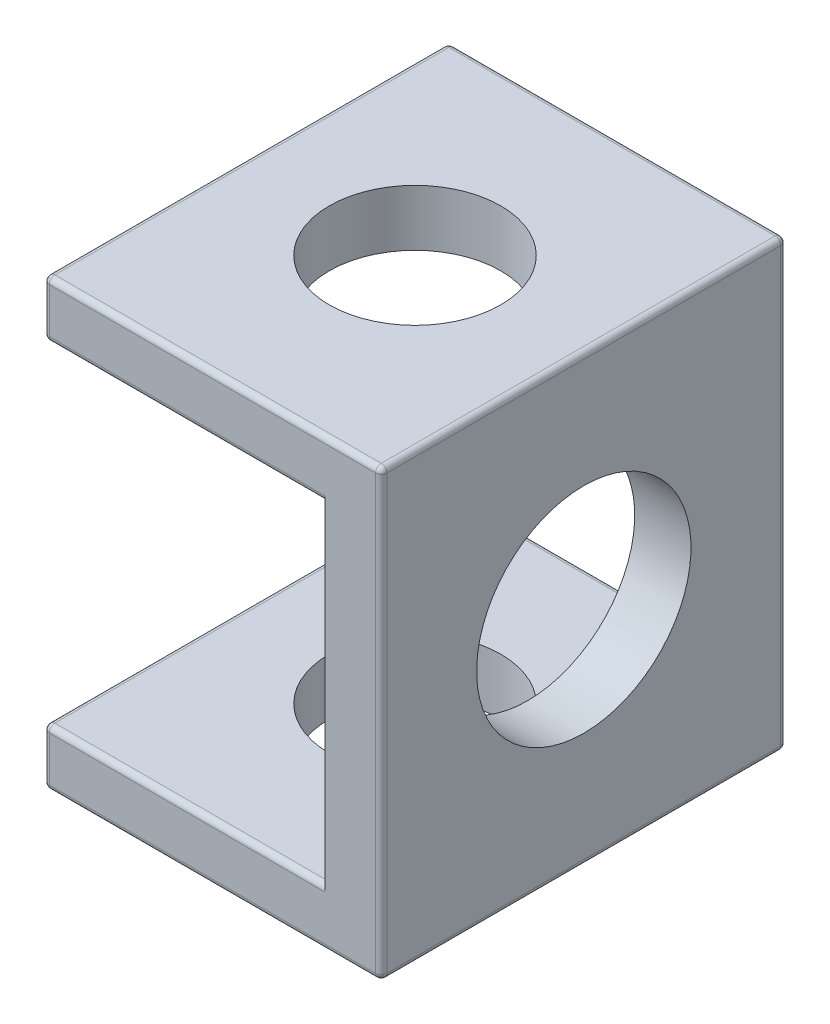
ISO-10303-21;
HEADER;
FILE_DESCRIPTION(('STEP AP214'),'2;1');
FILE_NAME('part.step','',(''),(''),'','','');
FILE_SCHEMA(('AUTOMOTIVE_DESIGN { 1 0 10303 214 1 1 1 1 }'));
ENDSEC;
DATA;
#1=APPLICATION_CONTEXT('core data for automotive mechanical design processes');
#2=APPLICATION_PROTOCOL_DEFINITION('international standard','automotive_design',2000,#1);
#3=PRODUCT_CONTEXT('',#1,'mechanical');
#4=PRODUCT('Part','Part','',(#3));
#5=PRODUCT_RELATED_PRODUCT_CATEGORY('part','',(#4));
#6=PRODUCT_DEFINITION_FORMATION('','',#4);
#7=PRODUCT_DEFINITION_CONTEXT('part definition',#1,'design');
#8=PRODUCT_DEFINITION('design','',#6,#7);
#9=PRODUCT_DEFINITION_SHAPE('','',#8);
#10=(LENGTH_UNIT() NAMED_UNIT(*) SI_UNIT(.MILLI.,.METRE.));
#11=(NAMED_UNIT(*) PLANE_ANGLE_UNIT() SI_UNIT($,.RADIAN.));
#12=(NAMED_UNIT(*) SI_UNIT($,.STERADIAN.) SOLID_ANGLE_UNIT());
#13=UNCERTAINTY_MEASURE_WITH_UNIT(LENGTH_MEASURE(1.E-05),#10,'distance_accuracy_value','');
#14=(GEOMETRIC_REPRESENTATION_CONTEXT(3) GLOBAL_UNCERTAINTY_ASSIGNED_CONTEXT((#13)) GLOBAL_UNIT_ASSIGNED_CONTEXT((#10,
#11,#12)) REPRESENTATION_CONTEXT('',''));
#15=CARTESIAN_POINT('',(0.,0.,0.));
#16=DIRECTION('',(0.,0.,1.));
#17=DIRECTION('',(1.,0.,0.));
#18=AXIS2_PLACEMENT_3D('',#15,#16,#17);
#19=CARTESIAN_POINT('',(60.,-69.,72.));
#20=DIRECTION('',(0.,-1.,0.));
#21=DIRECTION('',(1.,0.,0.));
#22=AXIS2_PLACEMENT_3D('',#19,#20,#21);
#23=PLANE('',#22);
#24=CARTESIAN_POINT('',(30.,-69.,36.));
#25=DIRECTION('',(0.,-1.,0.));
#26=DIRECTION('',(1.,0.,0.));
#27=AXIS2_PLACEMENT_3D('',#24,#25,#26);
#28=CIRCLE('',#27,15.24);
#29=CARTESIAN_POINT('',(45.24,-69.,36.));
#30=VERTEX_POINT('',#29);
#31=EDGE_CURVE('E1032',#30,#30,#28,.T.);
#32=ORIENTED_EDGE('',*,*,#31,.T.);
#33=EDGE_LOOP('',(#32));
#34=FACE_BOUND('',#33,.T.);
#35=DIRECTION('',(0.,0.,-1.));
#36=VECTOR('',#35,1.);
#37=CARTESIAN_POINT('',(50.,-69.,72.));
#38=LINE('',#37,#36);
#39=CARTESIAN_POINT('',(50.,-69.,71.));
#40=VERTEX_POINT('',#39);
#41=CARTESIAN_POINT('',(50.,-69.,1.));
#42=VERTEX_POINT('',#41);
#43=EDGE_CURVE('E475',#40,#42,#38,.T.);
#44=ORIENTED_EDGE('',*,*,#43,.T.);
#45=DIRECTION('',(-1.,0.,0.));
#46=VECTOR('',#45,1.);
#47=CARTESIAN_POINT('',(1.,-69.,1.));
#48=LINE('',#47,#46);
#49=CARTESIAN_POINT('',(1.,-69.,1.));
#50=VERTEX_POINT('',#49);
#51=EDGE_CURVE('E358',#42,#50,#48,.T.);
#52=ORIENTED_EDGE('',*,*,#51,.T.);
#53=DIRECTION('',(0.,0.,-1.));
#54=VECTOR('',#53,1.);
#55=CARTESIAN_POINT('',(1.,-69.,72.));
#56=LINE('',#55,#54);
#57=CARTESIAN_POINT('',(1.,-69.,71.));
#58=VERTEX_POINT('',#57);
#59=EDGE_CURVE('E343',#50,#58,#56,.F.);
#60=ORIENTED_EDGE('',*,*,#59,.T.);
#61=DIRECTION('',(-1.,0.,0.));
#62=VECTOR('',#61,1.);
#63=CARTESIAN_POINT('',(60.,-69.,71.));
#64=LINE('',#63,#62);
#65=EDGE_CURVE('E355',#58,#40,#64,.F.);
#66=ORIENTED_EDGE('',*,*,#65,.T.);
#67=EDGE_LOOP('',(#44,#52,#60,#66));
#68=FACE_BOUND('',#67,.T.);
#69=ADVANCED_FACE('F41',(#34,#68),#23,.F.);
#70=CARTESIAN_POINT('',(0.,-79.,72.));
#71=DIRECTION('',(-1.,0.,0.));
#72=DIRECTION('',(0.,-1.,0.));
#73=AXIS2_PLACEMENT_3D('',#70,#71,#72);
#74=PLANE('',#73);
#75=DIRECTION('',(0.,0.,-1.));
#76=VECTOR('',#75,1.);
#77=CARTESIAN_POINT('',(0.,-70.,0.));
#78=LINE('',#77,#76);
#79=CARTESIAN_POINT('',(0.,-70.,71.));
#80=VERTEX_POINT('',#79);
#81=CARTESIAN_POINT('',(0.,-70.,1.));
#82=VERTEX_POINT('',#81);
#83=EDGE_CURVE('E324',#80,#82,#78,.T.);
#84=ORIENTED_EDGE('',*,*,#83,.T.);
#85=DIRECTION('',(0.,1.,0.));
#86=VECTOR('',#85,1.);
#87=CARTESIAN_POINT('',(0.,-79.,1.));
#88=LINE('',#87,#86);
#89=CARTESIAN_POINT('',(0.,-78.,1.));
#90=VERTEX_POINT('',#89);
#91=EDGE_CURVE('E381',#82,#90,#88,.F.);
#92=ORIENTED_EDGE('',*,*,#91,.T.);
#93=DIRECTION('',(0.,0.,-1.));
#94=VECTOR('',#93,1.);
#95=CARTESIAN_POINT('',(0.,-78.,72.));
#96=LINE('',#95,#94);
#97=CARTESIAN_POINT('',(0.,-78.,71.));
#98=VERTEX_POINT('',#97);
#99=EDGE_CURVE('E351',#90,#98,#96,.F.);
#100=ORIENTED_EDGE('',*,*,#99,.T.);
#101=DIRECTION('',(0.,1.,0.));
#102=VECTOR('',#101,1.);
#103=CARTESIAN_POINT('',(0.,-70.,71.));
#104=LINE('',#103,#102);
#105=EDGE_CURVE('E378',#98,#80,#104,.T.);
#106=ORIENTED_EDGE('',*,*,#105,.T.);
#107=EDGE_LOOP('',(#84,#92,#100,#106));
#108=FACE_BOUND('',#107,.T.);
#109=ADVANCED_FACE('F566',(#108),#74,.T.);
#110=CARTESIAN_POINT('',(60.,-79.,72.));
#111=DIRECTION('',(0.,-1.,0.));
#112=DIRECTION('',(1.,0.,0.));
#113=AXIS2_PLACEMENT_3D('',#110,#111,#112);
#114=PLANE('',#113);
#115=CARTESIAN_POINT('',(30.,-79.,36.));
#116=DIRECTION('',(0.,-1.,0.));
#117=DIRECTION('',(1.,0.,0.));
#118=AXIS2_PLACEMENT_3D('',#115,#116,#117);
#119=CIRCLE('',#118,15.24);
#120=CARTESIAN_POINT('',(45.24,-79.,36.));
#121=VERTEX_POINT('',#120);
#122=EDGE_CURVE('E994',#121,#121,#119,.T.);
#123=ORIENTED_EDGE('',*,*,#122,.F.);
#124=EDGE_LOOP('',(#123));
#125=FACE_BOUND('',#124,.T.);
#126=DIRECTION('',(0.,0.,-1.));
#127=VECTOR('',#126,1.);
#128=CARTESIAN_POINT('',(1.00000000000001,-79.,72.));
#129=LINE('',#128,#127);
#130=CARTESIAN_POINT('',(1.00000000000001,-79.,71.));
#131=VERTEX_POINT('',#130);
#132=CARTESIAN_POINT('',(1.00000000000001,-79.,1.));
#133=VERTEX_POINT('',#132);
#134=EDGE_CURVE('E347',#131,#133,#129,.T.);
#135=ORIENTED_EDGE('',*,*,#134,.T.);
#136=DIRECTION('',(-1.,0.,0.));
#137=VECTOR('',#136,1.);
#138=CARTESIAN_POINT('',(60.,-79.,1.));
#139=LINE('',#138,#137);
#140=CARTESIAN_POINT('',(59.,-79.,1.));
#141=VERTEX_POINT('',#140);
#142=EDGE_CURVE('E396',#133,#141,#139,.F.);
#143=ORIENTED_EDGE('',*,*,#142,.T.);
#144=DIRECTION('',(0.,0.,-1.));
#145=VECTOR('',#144,1.);
#146=CARTESIAN_POINT('',(59.,-79.,72.));
#147=LINE('',#146,#145);
#148=CARTESIAN_POINT('',(59.,-79.,71.));
#149=VERTEX_POINT('',#148);
#150=EDGE_CURVE('E393',#141,#149,#147,.F.);
#151=ORIENTED_EDGE('',*,*,#150,.T.);
#152=DIRECTION('',(-1.,0.,0.));
#153=VECTOR('',#152,1.);
#154=CARTESIAN_POINT('',(1.00000000000002,-79.,71.));
#155=LINE('',#154,#153);
#156=EDGE_CURVE('E390',#149,#131,#155,.T.);
#157=ORIENTED_EDGE('',*,*,#156,.T.);
#158=EDGE_LOOP('',(#135,#143,#151,#157));
#159=FACE_BOUND('',#158,.T.);
#160=ADVANCED_FACE('F572',(#125,#159),#114,.T.);
#161=CARTESIAN_POINT('',(60.,0.,72.));
#162=DIRECTION('',(1.,0.,0.));
#163=DIRECTION('',(0.,1.,0.));
#164=AXIS2_PLACEMENT_3D('',#161,#162,#163);
#165=PLANE('',#164);
#166=CARTESIAN_POINT('',(60.,-39.5,36.));
#167=DIRECTION('',(-1.,0.,0.));
#168=DIRECTION('',(0.,-1.,0.));
#169=AXIS2_PLACEMENT_3D('',#166,#167,#168);
#170=CIRCLE('',#169,19.05);
#171=CARTESIAN_POINT('',(60.,-58.55,36.));
#172=VERTEX_POINT('',#171);
#173=EDGE_CURVE('E1033',#172,#172,#170,.T.);
#174=ORIENTED_EDGE('',*,*,#173,.T.);
#175=EDGE_LOOP('',(#174));
#176=FACE_BOUND('',#175,.T.);
#177=DIRECTION('',(0.,-1.,0.));
#178=VECTOR('',#177,1.);
#179=CARTESIAN_POINT('',(60.,-79.,71.));
#180=LINE('',#179,#178);
#181=CARTESIAN_POINT('',(60.,-1.,71.));
#182=VERTEX_POINT('',#181);
#183=CARTESIAN_POINT('',(60.,-78.,71.));
#184=VERTEX_POINT('',#183);
#185=EDGE_CURVE('E305',#182,#184,#180,.T.);
#186=ORIENTED_EDGE('',*,*,#185,.T.);
#187=DIRECTION('',(0.,0.,-1.));
#188=VECTOR('',#187,1.);
#189=CARTESIAN_POINT('',(60.,-78.,72.));
#190=LINE('',#189,#188);
#191=CARTESIAN_POINT('',(60.,-78.,1.));
#192=VERTEX_POINT('',#191);
#193=EDGE_CURVE('E402',#184,#192,#190,.T.);
#194=ORIENTED_EDGE('',*,*,#193,.T.);
#195=DIRECTION('',(0.,-1.,0.));
#196=VECTOR('',#195,1.);
#197=CARTESIAN_POINT('',(60.,0.,1.));
#198=LINE('',#197,#196);
#199=CARTESIAN_POINT('',(60.,-1.,1.));
#200=VERTEX_POINT('',#199);
#201=EDGE_CURVE('E302',#192,#200,#198,.F.);
#202=ORIENTED_EDGE('',*,*,#201,.T.);
#203=DIRECTION('',(0.,0.,-1.));
#204=VECTOR('',#203,1.);
#205=CARTESIAN_POINT('',(60.,-1.,72.));
#206=LINE('',#205,#204);
#207=EDGE_CURVE('E283',#200,#182,#206,.F.);
#208=ORIENTED_EDGE('',*,*,#207,.T.);
#209=EDGE_LOOP('',(#186,#194,#202,#208));
#210=FACE_BOUND('',#209,.T.);
#211=ADVANCED_FACE('F945',(#176,#210),#165,.T.);
#212=CARTESIAN_POINT('',(0.,0.,72.));
#213=DIRECTION('',(0.,1.,0.));
#214=DIRECTION('',(0.,0.,1.));
#215=AXIS2_PLACEMENT_3D('',#212,#213,#214);
#216=PLANE('',#215);
#217=CARTESIAN_POINT('',(30.,0.,36.));
#218=DIRECTION('',(0.,1.,0.));
#219=DIRECTION('',(0.,0.,1.));
#220=AXIS2_PLACEMENT_3D('',#217,#218,#219);
#221=CIRCLE('',#220,15.24);
#222=CARTESIAN_POINT('',(30.,0.,51.24));
#223=VERTEX_POINT('',#222);
#224=EDGE_CURVE('E1037',#223,#223,#221,.T.);
#225=ORIENTED_EDGE('',*,*,#224,.F.);
#226=EDGE_LOOP('',(#225));
#227=FACE_BOUND('',#226,.T.);
#228=DIRECTION('',(1.,0.,0.));
#229=VECTOR('',#228,1.);
#230=CARTESIAN_POINT('',(60.,0.,71.));
#231=LINE('',#230,#229);
#232=CARTESIAN_POINT('',(1.,0.,71.));
#233=VERTEX_POINT('',#232);
#234=CARTESIAN_POINT('',(59.,0.,71.));
#235=VERTEX_POINT('',#234);
#236=EDGE_CURVE('E272',#233,#235,#231,.T.);
#237=ORIENTED_EDGE('',*,*,#236,.T.);
#238=DIRECTION('',(0.,0.,-1.));
#239=VECTOR('',#238,1.);
#240=CARTESIAN_POINT('',(59.,0.,72.));
#241=LINE('',#240,#239);
#242=CARTESIAN_POINT('',(59.,0.,1.));
#243=VERTEX_POINT('',#242);
#244=EDGE_CURVE('E199',#235,#243,#241,.T.);
#245=ORIENTED_EDGE('',*,*,#244,.T.);
#246=DIRECTION('',(1.,0.,0.));
#247=VECTOR('',#246,1.);
#248=CARTESIAN_POINT('',(0.,0.,1.));
#249=LINE('',#248,#247);
#250=CARTESIAN_POINT('',(1.,0.,1.));
#251=VERTEX_POINT('',#250);
#252=EDGE_CURVE('E191',#243,#251,#249,.F.);
#253=ORIENTED_EDGE('',*,*,#252,.T.);
#254=DIRECTION('',(0.,0.,-1.));
#255=VECTOR('',#254,1.);
#256=CARTESIAN_POINT('',(1.,0.,72.));
#257=LINE('',#256,#255);
#258=EDGE_CURVE('E196',#251,#233,#257,.F.);
#259=ORIENTED_EDGE('',*,*,#258,.T.);
#260=EDGE_LOOP('',(#237,#245,#253,#259));
#261=FACE_BOUND('',#260,.T.);
#262=ADVANCED_FACE('F194',(#227,#261),#216,.T.);
#263=CARTESIAN_POINT('',(0.,-10.,72.));
#264=DIRECTION('',(-1.,0.,0.));
#265=DIRECTION('',(0.,0.,1.));
#266=AXIS2_PLACEMENT_3D('',#263,#264,#265);
#267=PLANE('',#266);
#268=DIRECTION('',(0.,0.,-1.));
#269=VECTOR('',#268,1.);
#270=CARTESIAN_POINT('',(0.,-9.,72.));
#271=LINE('',#270,#269);
#272=CARTESIAN_POINT('',(0.,-9.,1.));
#273=VERTEX_POINT('',#272);
#274=CARTESIAN_POINT('',(0.,-9.,71.));
#275=VERTEX_POINT('',#274);
#276=EDGE_CURVE('E498',#273,#275,#271,.F.);
#277=ORIENTED_EDGE('',*,*,#276,.T.);
#278=DIRECTION('',(0.,1.,0.));
#279=VECTOR('',#278,1.);
#280=CARTESIAN_POINT('',(0.,-0.999999999999999,71.));
#281=LINE('',#280,#279);
#282=CARTESIAN_POINT('',(0.,-0.999999999999999,71.));
#283=VERTEX_POINT('',#282);
#284=EDGE_CURVE('E277',#275,#283,#281,.T.);
#285=ORIENTED_EDGE('',*,*,#284,.T.);
#286=DIRECTION('',(0.,0.,-1.));
#287=VECTOR('',#286,1.);
#288=CARTESIAN_POINT('',(0.,-0.999999999999999,72.));
#289=LINE('',#288,#287);
#290=CARTESIAN_POINT('',(0.,-0.999999999999999,1.));
#291=VERTEX_POINT('',#290);
#292=EDGE_CURVE('E203',#283,#291,#289,.T.);
#293=ORIENTED_EDGE('',*,*,#292,.T.);
#294=DIRECTION('',(0.,1.,0.));
#295=VECTOR('',#294,1.);
#296=CARTESIAN_POINT('',(0.,-10.,1.));
#297=LINE('',#296,#295);
#298=EDGE_CURVE('E216',#291,#273,#297,.F.);
#299=ORIENTED_EDGE('',*,*,#298,.T.);
#300=EDGE_LOOP('',(#277,#285,#293,#299));
#301=FACE_BOUND('',#300,.T.);
#302=ADVANCED_FACE('F535',(#301),#267,.T.);
#303=CARTESIAN_POINT('',(0.,-10.,72.));
#304=DIRECTION('',(0.,1.,0.));
#305=DIRECTION('',(0.,0.,1.));
#306=AXIS2_PLACEMENT_3D('',#303,#304,#305);
#307=PLANE('',#306);
#308=CARTESIAN_POINT('',(30.,-10.,36.));
#309=DIRECTION('',(0.,1.,0.));
#310=DIRECTION('',(0.,0.,1.));
#311=AXIS2_PLACEMENT_3D('',#308,#309,#310);
#312=CIRCLE('',#311,15.24);
#313=CARTESIAN_POINT('',(30.,-10.,51.24));
#314=VERTEX_POINT('',#313);
#315=EDGE_CURVE('E1043',#314,#314,#312,.T.);
#316=ORIENTED_EDGE('',*,*,#315,.T.);
#317=EDGE_LOOP('',(#316));
#318=FACE_BOUND('',#317,.T.);
#319=DIRECTION('',(0.,0.,-1.));
#320=VECTOR('',#319,1.);
#321=CARTESIAN_POINT('',(50.,-10.,72.));
#322=LINE('',#321,#320);
#323=CARTESIAN_POINT('',(50.,-10.,71.));
#324=VERTEX_POINT('',#323);
#325=CARTESIAN_POINT('',(50.,-10.,1.));
#326=VERTEX_POINT('',#325);
#327=EDGE_CURVE('E482',#324,#326,#322,.T.);
#328=ORIENTED_EDGE('',*,*,#327,.F.);
#329=DIRECTION('',(1.,0.,0.));
#330=VECTOR('',#329,1.);
#331=CARTESIAN_POINT('',(0.,-10.,71.));
#332=LINE('',#331,#330);
#333=CARTESIAN_POINT('',(1.,-10.,71.));
#334=VERTEX_POINT('',#333);
#335=EDGE_CURVE('E266',#324,#334,#332,.F.);
#336=ORIENTED_EDGE('',*,*,#335,.T.);
#337=DIRECTION('',(0.,0.,-1.));
#338=VECTOR('',#337,1.);
#339=CARTESIAN_POINT('',(1.,-10.,0.));
#340=LINE('',#339,#338);
#341=CARTESIAN_POINT('',(1.,-10.,1.));
#342=VERTEX_POINT('',#341);
#343=EDGE_CURVE('E495',#334,#342,#340,.T.);
#344=ORIENTED_EDGE('',*,*,#343,.T.);
#345=DIRECTION('',(1.,0.,0.));
#346=VECTOR('',#345,1.);
#347=CARTESIAN_POINT('',(50.,-10.,1.));
#348=LINE('',#347,#346);
#349=EDGE_CURVE('E502',#342,#326,#348,.T.);
#350=ORIENTED_EDGE('',*,*,#349,.T.);
#351=EDGE_LOOP('',(#328,#336,#344,#350));
#352=FACE_BOUND('',#351,.T.);
#353=ADVANCED_FACE('F526',(#318,#352),#307,.F.);
#354=CARTESIAN_POINT('',(50.,0.,72.));
#355=DIRECTION('',(1.,0.,0.));
#356=DIRECTION('',(0.,1.,0.));
#357=AXIS2_PLACEMENT_3D('',#354,#355,#356);
#358=PLANE('',#357);
#359=CARTESIAN_POINT('',(50.,-39.5,36.));
#360=DIRECTION('',(-1.,0.,0.));
#361=DIRECTION('',(0.,-1.,0.));
#362=AXIS2_PLACEMENT_3D('',#359,#360,#361);
#363=CIRCLE('',#362,19.05);
#364=CARTESIAN_POINT('',(50.,-58.55,36.));
#365=VERTEX_POINT('',#364);
#366=EDGE_CURVE('E257',#365,#365,#363,.T.);
#367=ORIENTED_EDGE('',*,*,#366,.F.);
#368=EDGE_LOOP('',(#367));
#369=FACE_BOUND('',#368,.T.);
#370=DIRECTION('',(0.,-1.,0.));
#371=VECTOR('',#370,1.);
#372=CARTESIAN_POINT('',(50.,0.,0.));
#373=LINE('',#372,#371);
#374=CARTESIAN_POINT('',(50.,-9.,0.));
#375=VERTEX_POINT('',#374);
#376=CARTESIAN_POINT('',(50.,-70.,0.));
#377=VERTEX_POINT('',#376);
#378=EDGE_CURVE('E487',#375,#377,#373,.T.);
#379=ORIENTED_EDGE('',*,*,#378,.T.);
#380=CARTESIAN_POINT('',(50.,-70.,1.));
#381=DIRECTION('',(1.,0.,0.));
#382=DIRECTION('',(0.,1.,0.));
#383=AXIS2_PLACEMENT_3D('',#380,#381,#382);
#384=CIRCLE('',#383,1.);
#385=EDGE_CURVE('E51',#377,#42,#384,.T.);
#386=ORIENTED_EDGE('',*,*,#385,.T.);
#387=ORIENTED_EDGE('',*,*,#43,.F.);
#388=CARTESIAN_POINT('',(50.,-70.,71.));
#389=DIRECTION('',(1.,0.,0.));
#390=DIRECTION('',(0.,1.,0.));
#391=AXIS2_PLACEMENT_3D('',#388,#389,#390);
#392=CIRCLE('',#391,1.);
#393=CARTESIAN_POINT('',(50.,-70.,72.));
#394=VERTEX_POINT('',#393);
#395=EDGE_CURVE('E11',#40,#394,#392,.T.);
#396=ORIENTED_EDGE('',*,*,#395,.T.);
#397=DIRECTION('',(0.,-1.,0.));
#398=VECTOR('',#397,1.);
#399=CARTESIAN_POINT('',(50.,0.,72.));
#400=LINE('',#399,#398);
#401=CARTESIAN_POINT('',(50.,-9.,72.));
#402=VERTEX_POINT('',#401);
#403=EDGE_CURVE('E59',#402,#394,#400,.T.);
#404=ORIENTED_EDGE('',*,*,#403,.F.);
#405=CARTESIAN_POINT('',(50.,-9.,71.));
#406=DIRECTION('',(1.,0.,0.));
#407=DIRECTION('',(0.,1.,0.));
#408=AXIS2_PLACEMENT_3D('',#405,#406,#407);
#409=CIRCLE('',#408,1.);
#410=EDGE_CURVE('E280',#402,#324,#409,.T.);
#411=ORIENTED_EDGE('',*,*,#410,.T.);
#412=ORIENTED_EDGE('',*,*,#327,.T.);
#413=CARTESIAN_POINT('',(50.,-9.,1.));
#414=DIRECTION('',(1.,0.,0.));
#415=DIRECTION('',(0.,1.,0.));
#416=AXIS2_PLACEMENT_3D('',#413,#414,#415);
#417=CIRCLE('',#416,1.);
#418=EDGE_CURVE('E241',#326,#375,#417,.T.);
#419=ORIENTED_EDGE('',*,*,#418,.T.);
#420=EDGE_LOOP('',(#379,#386,#387,#396,#404,#411,#412,#419));
#421=FACE_BOUND('',#420,.T.);
#422=ADVANCED_FACE('F479',(#369,#421),#358,.F.);
#423=CARTESIAN_POINT('',(0.,0.,72.));
#424=DIRECTION('',(0.,0.,-1.));
#425=DIRECTION('',(-1.,0.,0.));
#426=AXIS2_PLACEMENT_3D('',#423,#424,#425);
#427=PLANE('',#426);
#428=ORIENTED_EDGE('',*,*,#403,.T.);
#429=DIRECTION('',(-1.,0.,0.));
#430=VECTOR('',#429,1.);
#431=CARTESIAN_POINT('',(0.,-70.,72.));
#432=LINE('',#431,#430);
#433=CARTESIAN_POINT('',(1.,-70.,72.));
#434=VERTEX_POINT('',#433);
#435=EDGE_CURVE('E410',#394,#434,#432,.T.);
#436=ORIENTED_EDGE('',*,*,#435,.T.);
#437=DIRECTION('',(0.,1.,0.));
#438=VECTOR('',#437,1.);
#439=CARTESIAN_POINT('',(1.00000000000001,-78.,72.));
#440=LINE('',#439,#438);
#441=CARTESIAN_POINT('',(1.00000000000001,-78.,72.));
#442=VERTEX_POINT('',#441);
#443=EDGE_CURVE('E64',#434,#442,#440,.F.);
#444=ORIENTED_EDGE('',*,*,#443,.T.);
#445=DIRECTION('',(-1.,0.,0.));
#446=VECTOR('',#445,1.);
#447=CARTESIAN_POINT('',(59.,-78.,72.));
#448=LINE('',#447,#446);
#449=CARTESIAN_POINT('',(59.,-78.,72.));
#450=VERTEX_POINT('',#449);
#451=EDGE_CURVE('E413',#442,#450,#448,.F.);
#452=ORIENTED_EDGE('',*,*,#451,.T.);
#453=DIRECTION('',(0.,-1.,0.));
#454=VECTOR('',#453,1.);
#455=CARTESIAN_POINT('',(59.,-1.,72.));
#456=LINE('',#455,#454);
#457=CARTESIAN_POINT('',(59.,-1.,72.));
#458=VERTEX_POINT('',#457);
#459=EDGE_CURVE('E309',#450,#458,#456,.F.);
#460=ORIENTED_EDGE('',*,*,#459,.T.);
#461=DIRECTION('',(1.,0.,0.));
#462=VECTOR('',#461,1.);
#463=CARTESIAN_POINT('',(1.,-1.,72.));
#464=LINE('',#463,#462);
#465=CARTESIAN_POINT('',(1.,-0.999999999999999,72.));
#466=VERTEX_POINT('',#465);
#467=EDGE_CURVE('E260',#458,#466,#464,.F.);
#468=ORIENTED_EDGE('',*,*,#467,.T.);
#469=DIRECTION('',(0.,1.,0.));
#470=VECTOR('',#469,1.);
#471=CARTESIAN_POINT('',(1.,-9.,72.));
#472=LINE('',#471,#470);
#473=CARTESIAN_POINT('',(1.,-9.,72.));
#474=VERTEX_POINT('',#473);
#475=EDGE_CURVE('E245',#466,#474,#472,.F.);
#476=ORIENTED_EDGE('',*,*,#475,.T.);
#477=DIRECTION('',(1.,0.,0.));
#478=VECTOR('',#477,1.);
#479=CARTESIAN_POINT('',(0.,-9.,72.));
#480=LINE('',#479,#478);
#481=EDGE_CURVE('E263',#474,#402,#480,.T.);
#482=ORIENTED_EDGE('',*,*,#481,.T.);
#483=EDGE_LOOP('',(#428,#436,#444,#452,#460,#468,#476,#482));
#484=FACE_BOUND('',#483,.T.);
#485=ADVANCED_FACE('F548',(#484),#427,.F.);
#486=CARTESIAN_POINT('',(0.,0.,0.));
#487=DIRECTION('',(0.,0.,-1.));
#488=DIRECTION('',(-1.,0.,0.));
#489=AXIS2_PLACEMENT_3D('',#486,#487,#488);
#490=PLANE('',#489);
#491=DIRECTION('',(-1.,0.,0.));
#492=VECTOR('',#491,1.);
#493=CARTESIAN_POINT('',(50.,-70.,0.));
#494=LINE('',#493,#492);
#495=CARTESIAN_POINT('',(1.,-70.,0.));
#496=VERTEX_POINT('',#495);
#497=EDGE_CURVE('E368',#496,#377,#494,.F.);
#498=ORIENTED_EDGE('',*,*,#497,.T.);
#499=ORIENTED_EDGE('',*,*,#378,.F.);
#500=DIRECTION('',(1.,0.,0.));
#501=VECTOR('',#500,1.);
#502=CARTESIAN_POINT('',(1.,-9.,0.));
#503=LINE('',#502,#501);
#504=CARTESIAN_POINT('',(1.,-9.,0.));
#505=VERTEX_POINT('',#504);
#506=EDGE_CURVE('E235',#375,#505,#503,.F.);
#507=ORIENTED_EDGE('',*,*,#506,.T.);
#508=DIRECTION('',(0.,1.,0.));
#509=VECTOR('',#508,1.);
#510=CARTESIAN_POINT('',(1.,0.,0.));
#511=LINE('',#510,#509);
#512=CARTESIAN_POINT('',(1.,-1.,0.));
#513=VERTEX_POINT('',#512);
#514=EDGE_CURVE('E506',#505,#513,#511,.T.);
#515=ORIENTED_EDGE('',*,*,#514,.T.);
#516=DIRECTION('',(1.,0.,0.));
#517=VECTOR('',#516,1.);
#518=CARTESIAN_POINT('',(0.,-1.,0.));
#519=LINE('',#518,#517);
#520=CARTESIAN_POINT('',(59.,-1.,0.));
#521=VERTEX_POINT('',#520);
#522=EDGE_CURVE('E210',#513,#521,#519,.T.);
#523=ORIENTED_EDGE('',*,*,#522,.T.);
#524=DIRECTION('',(0.,-1.,0.));
#525=VECTOR('',#524,1.);
#526=CARTESIAN_POINT('',(59.,0.,0.));
#527=LINE('',#526,#525);
#528=CARTESIAN_POINT('',(59.,-78.,0.));
#529=VERTEX_POINT('',#528);
#530=EDGE_CURVE('E315',#521,#529,#527,.T.);
#531=ORIENTED_EDGE('',*,*,#530,.T.);
#532=DIRECTION('',(-1.,0.,0.));
#533=VECTOR('',#532,1.);
#534=CARTESIAN_POINT('',(0.,-78.,0.));
#535=LINE('',#534,#533);
#536=CARTESIAN_POINT('',(1.00000000000001,-78.,0.));
#537=VERTEX_POINT('',#536);
#538=EDGE_CURVE('E362',#529,#537,#535,.T.);
#539=ORIENTED_EDGE('',*,*,#538,.T.);
#540=DIRECTION('',(0.,1.,0.));
#541=VECTOR('',#540,1.);
#542=CARTESIAN_POINT('',(0.999999999999952,0.,0.));
#543=LINE('',#542,#541);
#544=EDGE_CURVE('E365',#537,#496,#543,.T.);
#545=ORIENTED_EDGE('',*,*,#544,.T.);
#546=EDGE_LOOP('',(#498,#499,#507,#515,#523,#531,#539,#545));
#547=FACE_BOUND('',#546,.T.);
#548=ADVANCED_FACE('F512',(#547),#490,.T.);
#549=CARTESIAN_POINT('',(30.,-10.,36.));
#550=DIRECTION('',(0.,1.,0.));
#551=DIRECTION('',(0.,0.,1.));
#552=AXIS2_PLACEMENT_3D('',#549,#550,#551);
#553=CYLINDRICAL_SURFACE('',#552,15.24);
#554=ORIENTED_EDGE('',*,*,#315,.F.);
#555=EDGE_LOOP('',(#554));
#556=FACE_BOUND('',#555,.T.);
#557=ORIENTED_EDGE('',*,*,#224,.T.);
#558=EDGE_LOOP('',(#557));
#559=FACE_BOUND('',#558,.T.);
#560=ADVANCED_FACE('F894',(#556,#559),#553,.F.);
#561=CARTESIAN_POINT('',(30.,-69.,36.));
#562=DIRECTION('',(0.,-1.,0.));
#563=DIRECTION('',(1.,0.,0.));
#564=AXIS2_PLACEMENT_3D('',#561,#562,#563);
#565=CYLINDRICAL_SURFACE('',#564,15.24);
#566=ORIENTED_EDGE('',*,*,#31,.F.);
#567=EDGE_LOOP('',(#566));
#568=FACE_BOUND('',#567,.T.);
#569=ORIENTED_EDGE('',*,*,#122,.T.);
#570=EDGE_LOOP('',(#569));
#571=FACE_BOUND('',#570,.T.);
#572=ADVANCED_FACE('F885',(#568,#571),#565,.F.);
#573=CARTESIAN_POINT('',(60.,-39.5,36.));
#574=DIRECTION('',(-1.,0.,0.));
#575=DIRECTION('',(0.,-1.,0.));
#576=AXIS2_PLACEMENT_3D('',#573,#574,#575);
#577=CYLINDRICAL_SURFACE('',#576,19.05);
#578=ORIENTED_EDGE('',*,*,#173,.F.);
#579=EDGE_LOOP('',(#578));
#580=FACE_BOUND('',#579,.T.);
#581=ORIENTED_EDGE('',*,*,#366,.T.);
#582=EDGE_LOOP('',(#581));
#583=FACE_BOUND('',#582,.T.);
#584=ADVANCED_FACE('F582',(#580,#583),#577,.F.);
#585=CARTESIAN_POINT('',(0.,-1.,1.));
#586=DIRECTION('',(1.,0.,0.));
#587=DIRECTION('',(0.,0.,-1.));
#588=AXIS2_PLACEMENT_3D('',#585,#586,#587);
#589=CYLINDRICAL_SURFACE('',#588,1.);
#590=ORIENTED_EDGE('',*,*,#252,.F.);
#591=CARTESIAN_POINT('',(59.,-1.,1.));
#592=DIRECTION('',(1.,0.,0.));
#593=DIRECTION('',(0.,0.,-1.));
#594=AXIS2_PLACEMENT_3D('',#591,#592,#593);
#595=CIRCLE('',#594,1.);
#596=EDGE_CURVE('E319',#243,#521,#595,.F.);
#597=ORIENTED_EDGE('',*,*,#596,.T.);
#598=ORIENTED_EDGE('',*,*,#522,.F.);
#599=CARTESIAN_POINT('',(1.,-1.,1.));
#600=DIRECTION('',(1.,0.,0.));
#601=DIRECTION('',(0.,0.,-1.));
#602=AXIS2_PLACEMENT_3D('',#599,#600,#601);
#603=CIRCLE('',#602,1.);
#604=EDGE_CURVE('E207',#513,#251,#603,.T.);
#605=ORIENTED_EDGE('',*,*,#604,.T.);
#606=EDGE_LOOP('',(#590,#597,#598,#605));
#607=FACE_BOUND('',#606,.T.);
#608=ADVANCED_FACE('F208',(#607),#589,.T.);
#609=CARTESIAN_POINT('',(1.,-0.999999999999999,72.));
#610=DIRECTION('',(0.,0.,-1.));
#611=DIRECTION('',(-1.,0.,0.));
#612=AXIS2_PLACEMENT_3D('',#609,#610,#611);
#613=CYLINDRICAL_SURFACE('',#612,1.);
#614=ORIENTED_EDGE('',*,*,#292,.F.);
#615=CARTESIAN_POINT('',(1.,-0.999999999999999,71.));
#616=DIRECTION('',(0.,0.,-1.));
#617=DIRECTION('',(-1.,0.,0.));
#618=AXIS2_PLACEMENT_3D('',#615,#616,#617);
#619=CIRCLE('',#618,1.);
#620=EDGE_CURVE('E224',#283,#233,#619,.T.);
#621=ORIENTED_EDGE('',*,*,#620,.T.);
#622=ORIENTED_EDGE('',*,*,#258,.F.);
#623=CARTESIAN_POINT('',(1.,-0.999999999999999,1.));
#624=DIRECTION('',(0.,0.,-1.));
#625=DIRECTION('',(-1.,0.,0.));
#626=AXIS2_PLACEMENT_3D('',#623,#624,#625);
#627=CIRCLE('',#626,1.);
#628=EDGE_CURVE('E217',#251,#291,#627,.F.);
#629=ORIENTED_EDGE('',*,*,#628,.T.);
#630=EDGE_LOOP('',(#614,#621,#622,#629));
#631=FACE_BOUND('',#630,.T.);
#632=ADVANCED_FACE('F222',(#631),#613,.T.);
#633=CARTESIAN_POINT('',(1.,-9.,72.));
#634=DIRECTION('',(0.,0.,1.));
#635=DIRECTION('',(1.,0.,0.));
#636=AXIS2_PLACEMENT_3D('',#633,#634,#635);
#637=CYLINDRICAL_SURFACE('',#636,1.);
#638=ORIENTED_EDGE('',*,*,#343,.F.);
#639=CARTESIAN_POINT('',(1.,-9.,71.));
#640=DIRECTION('',(0.,0.,1.));
#641=DIRECTION('',(1.,0.,0.));
#642=AXIS2_PLACEMENT_3D('',#639,#640,#641);
#643=CIRCLE('',#642,1.);
#644=EDGE_CURVE('E269',#334,#275,#643,.F.);
#645=ORIENTED_EDGE('',*,*,#644,.T.);
#646=ORIENTED_EDGE('',*,*,#276,.F.);
#647=CARTESIAN_POINT('',(1.,-9.,1.));
#648=DIRECTION('',(0.,0.,1.));
#649=DIRECTION('',(1.,0.,0.));
#650=AXIS2_PLACEMENT_3D('',#647,#648,#649);
#651=CIRCLE('',#650,1.);
#652=EDGE_CURVE('E231',#273,#342,#651,.T.);
#653=ORIENTED_EDGE('',*,*,#652,.T.);
#654=EDGE_LOOP('',(#638,#645,#646,#653));
#655=FACE_BOUND('',#654,.T.);
#656=ADVANCED_FACE('F532',(#655),#637,.T.);
#657=CARTESIAN_POINT('',(1.,-1.,1.));
#658=DIRECTION('',(0.,0.,1.));
#659=DIRECTION('',(1.,0.,0.));
#660=AXIS2_PLACEMENT_3D('',#657,#658,#659);
#661=SPHERICAL_SURFACE('',#660,1.);
#662=ORIENTED_EDGE('',*,*,#628,.F.);
#663=ORIENTED_EDGE('',*,*,#604,.F.);
#664=CARTESIAN_POINT('',(1.,-0.999999999999999,1.));
#665=DIRECTION('',(0.,-1.,0.));
#666=DIRECTION('',(0.,0.,-1.));
#667=AXIS2_PLACEMENT_3D('',#664,#665,#666);
#668=CIRCLE('',#667,1.);
#669=EDGE_CURVE('E228',#291,#513,#668,.T.);
#670=ORIENTED_EDGE('',*,*,#669,.F.);
#671=EDGE_LOOP('',(#662,#663,#670));
#672=FACE_BOUND('',#671,.T.);
#673=ADVANCED_FACE('F227',(#672),#661,.T.);
#674=CARTESIAN_POINT('',(1.,0.,1.));
#675=DIRECTION('',(0.,1.,0.));
#676=DIRECTION('',(0.,0.,1.));
#677=AXIS2_PLACEMENT_3D('',#674,#675,#676);
#678=CYLINDRICAL_SURFACE('',#677,1.);
#679=CARTESIAN_POINT('',(1.,-9.,1.));
#680=DIRECTION('',(0.,-1.,0.));
#681=DIRECTION('',(0.,0.,-1.));
#682=AXIS2_PLACEMENT_3D('',#679,#680,#681);
#683=CIRCLE('',#682,1.);
#684=EDGE_CURVE('E250',#273,#505,#683,.T.);
#685=ORIENTED_EDGE('',*,*,#684,.F.);
#686=ORIENTED_EDGE('',*,*,#298,.F.);
#687=ORIENTED_EDGE('',*,*,#669,.T.);
#688=ORIENTED_EDGE('',*,*,#514,.F.);
#689=EDGE_LOOP('',(#685,#686,#687,#688));
#690=FACE_BOUND('',#689,.T.);
#691=ADVANCED_FACE('F517',(#690),#678,.T.);
#692=CARTESIAN_POINT('',(1.,-9.,1.));
#693=DIRECTION('',(0.,0.,-1.));
#694=DIRECTION('',(-1.,0.,0.));
#695=AXIS2_PLACEMENT_3D('',#692,#693,#694);
#696=SPHERICAL_SURFACE('',#695,1.);
#697=ORIENTED_EDGE('',*,*,#652,.F.);
#698=ORIENTED_EDGE('',*,*,#684,.T.);
#699=CARTESIAN_POINT('',(1.,-9.,1.));
#700=DIRECTION('',(1.,0.,0.));
#701=DIRECTION('',(0.,0.,-1.));
#702=AXIS2_PLACEMENT_3D('',#699,#700,#701);
#703=CIRCLE('',#702,1.);
#704=EDGE_CURVE('E246',#342,#505,#703,.T.);
#705=ORIENTED_EDGE('',*,*,#704,.F.);
#706=EDGE_LOOP('',(#697,#698,#705));
#707=FACE_BOUND('',#706,.T.);
#708=ADVANCED_FACE('F521',(#707),#696,.T.);
#709=CARTESIAN_POINT('',(0.,-9.,1.));
#710=DIRECTION('',(-1.,0.,0.));
#711=DIRECTION('',(0.,0.,1.));
#712=AXIS2_PLACEMENT_3D('',#709,#710,#711);
#713=CYLINDRICAL_SURFACE('',#712,1.);
#714=ORIENTED_EDGE('',*,*,#704,.T.);
#715=ORIENTED_EDGE('',*,*,#506,.F.);
#716=ORIENTED_EDGE('',*,*,#418,.F.);
#717=ORIENTED_EDGE('',*,*,#349,.F.);
#718=EDGE_LOOP('',(#714,#715,#716,#717));
#719=FACE_BOUND('',#718,.T.);
#720=ADVANCED_FACE('F523',(#719),#713,.T.);
#721=CARTESIAN_POINT('',(0.,-1.,71.));
#722=DIRECTION('',(-1.,0.,0.));
#723=DIRECTION('',(0.,0.,1.));
#724=AXIS2_PLACEMENT_3D('',#721,#722,#723);
#725=CYLINDRICAL_SURFACE('',#724,1.);
#726=ORIENTED_EDGE('',*,*,#467,.F.);
#727=CARTESIAN_POINT('',(59.,-1.,71.));
#728=DIRECTION('',(-1.,0.,0.));
#729=DIRECTION('',(0.,0.,1.));
#730=AXIS2_PLACEMENT_3D('',#727,#728,#729);
#731=CIRCLE('',#730,1.);
#732=EDGE_CURVE('E312',#458,#235,#731,.T.);
#733=ORIENTED_EDGE('',*,*,#732,.T.);
#734=ORIENTED_EDGE('',*,*,#236,.F.);
#735=CARTESIAN_POINT('',(1.,-1.,71.));
#736=DIRECTION('',(-1.,0.,0.));
#737=DIRECTION('',(0.,0.,1.));
#738=AXIS2_PLACEMENT_3D('',#735,#736,#737);
#739=CIRCLE('',#738,1.);
#740=EDGE_CURVE('E251',#466,#233,#739,.T.);
#741=ORIENTED_EDGE('',*,*,#740,.F.);
#742=EDGE_LOOP('',(#726,#733,#734,#741));
#743=FACE_BOUND('',#742,.T.);
#744=ADVANCED_FACE('F554',(#743),#725,.T.);
#745=CARTESIAN_POINT('',(1.,-0.999999999999999,71.));
#746=DIRECTION('',(0.,0.,-1.));
#747=DIRECTION('',(-1.,0.,0.));
#748=AXIS2_PLACEMENT_3D('',#745,#746,#747);
#749=SPHERICAL_SURFACE('',#748,1.);
#750=ORIENTED_EDGE('',*,*,#740,.T.);
#751=ORIENTED_EDGE('',*,*,#620,.F.);
#752=CARTESIAN_POINT('',(1.,-0.999999999999999,71.));
#753=DIRECTION('',(0.,-1.,0.));
#754=DIRECTION('',(0.,0.,-1.));
#755=AXIS2_PLACEMENT_3D('',#752,#753,#754);
#756=CIRCLE('',#755,1.);
#757=EDGE_CURVE('E293',#466,#283,#756,.T.);
#758=ORIENTED_EDGE('',*,*,#757,.F.);
#759=EDGE_LOOP('',(#750,#751,#758));
#760=FACE_BOUND('',#759,.T.);
#761=ADVANCED_FACE('F556',(#760),#749,.T.);
#762=CARTESIAN_POINT('',(1.,-10.,71.));
#763=DIRECTION('',(0.,-1.,0.));
#764=DIRECTION('',(0.,0.,-1.));
#765=AXIS2_PLACEMENT_3D('',#762,#763,#764);
#766=CYLINDRICAL_SURFACE('',#765,1.);
#767=ORIENTED_EDGE('',*,*,#757,.T.);
#768=ORIENTED_EDGE('',*,*,#284,.F.);
#769=CARTESIAN_POINT('',(1.,-9.,71.));
#770=DIRECTION('',(0.,-1.,0.));
#771=DIRECTION('',(0.,0.,-1.));
#772=AXIS2_PLACEMENT_3D('',#769,#770,#771);
#773=CIRCLE('',#772,1.);
#774=EDGE_CURVE('E288',#474,#275,#773,.T.);
#775=ORIENTED_EDGE('',*,*,#774,.F.);
#776=ORIENTED_EDGE('',*,*,#475,.F.);
#777=EDGE_LOOP('',(#767,#768,#775,#776));
#778=FACE_BOUND('',#777,.T.);
#779=ADVANCED_FACE('F538',(#778),#766,.T.);
#780=CARTESIAN_POINT('',(1.,-9.,71.));
#781=DIRECTION('',(0.,0.,-1.));
#782=DIRECTION('',(-1.,0.,0.));
#783=AXIS2_PLACEMENT_3D('',#780,#781,#782);
#784=SPHERICAL_SURFACE('',#783,1.);
#785=ORIENTED_EDGE('',*,*,#774,.T.);
#786=ORIENTED_EDGE('',*,*,#644,.F.);
#787=CARTESIAN_POINT('',(1.,-9.,71.));
#788=DIRECTION('',(1.,0.,0.));
#789=DIRECTION('',(0.,0.,-1.));
#790=AXIS2_PLACEMENT_3D('',#787,#788,#789);
#791=CIRCLE('',#790,1.);
#792=EDGE_CURVE('E284',#474,#334,#791,.T.);
#793=ORIENTED_EDGE('',*,*,#792,.F.);
#794=EDGE_LOOP('',(#785,#786,#793));
#795=FACE_BOUND('',#794,.T.);
#796=ADVANCED_FACE('F543',(#795),#784,.T.);
#797=CARTESIAN_POINT('',(0.,-9.,71.));
#798=DIRECTION('',(1.,0.,0.));
#799=DIRECTION('',(0.,0.,-1.));
#800=AXIS2_PLACEMENT_3D('',#797,#798,#799);
#801=CYLINDRICAL_SURFACE('',#800,1.);
#802=ORIENTED_EDGE('',*,*,#792,.T.);
#803=ORIENTED_EDGE('',*,*,#335,.F.);
#804=ORIENTED_EDGE('',*,*,#410,.F.);
#805=ORIENTED_EDGE('',*,*,#481,.F.);
#806=EDGE_LOOP('',(#802,#803,#804,#805));
#807=FACE_BOUND('',#806,.T.);
#808=ADVANCED_FACE('F547',(#807),#801,.T.);
#809=CARTESIAN_POINT('',(59.,0.,1.));
#810=DIRECTION('',(0.,-1.,0.));
#811=DIRECTION('',(1.,0.,0.));
#812=AXIS2_PLACEMENT_3D('',#809,#810,#811);
#813=CYLINDRICAL_SURFACE('',#812,1.);
#814=ORIENTED_EDGE('',*,*,#201,.F.);
#815=CARTESIAN_POINT('',(59.,-78.,1.));
#816=DIRECTION('',(0.,-1.,0.));
#817=DIRECTION('',(1.,0.,0.));
#818=AXIS2_PLACEMENT_3D('',#815,#816,#817);
#819=CIRCLE('',#818,1.);
#820=EDGE_CURVE('E399',#192,#529,#819,.F.);
#821=ORIENTED_EDGE('',*,*,#820,.T.);
#822=ORIENTED_EDGE('',*,*,#530,.F.);
#823=CARTESIAN_POINT('',(59.,-1.,1.));
#824=DIRECTION('',(0.,1.,0.));
#825=DIRECTION('',(-1.,0.,0.));
#826=AXIS2_PLACEMENT_3D('',#823,#824,#825);
#827=CIRCLE('',#826,1.);
#828=EDGE_CURVE('E289',#200,#521,#827,.T.);
#829=ORIENTED_EDGE('',*,*,#828,.F.);
#830=EDGE_LOOP('',(#814,#821,#822,#829));
#831=FACE_BOUND('',#830,.T.);
#832=ADVANCED_FACE('F595',(#831),#813,.T.);
#833=CARTESIAN_POINT('',(59.,-1.,1.));
#834=DIRECTION('',(1.,0.,0.));
#835=DIRECTION('',(0.,1.,0.));
#836=AXIS2_PLACEMENT_3D('',#833,#834,#835);
#837=SPHERICAL_SURFACE('',#836,1.);
#838=ORIENTED_EDGE('',*,*,#828,.T.);
#839=ORIENTED_EDGE('',*,*,#596,.F.);
#840=CARTESIAN_POINT('',(59.,-1.,1.));
#841=DIRECTION('',(0.,0.,1.));
#842=DIRECTION('',(0.,-1.,0.));
#843=AXIS2_PLACEMENT_3D('',#840,#841,#842);
#844=CIRCLE('',#843,1.);
#845=EDGE_CURVE('E333',#200,#243,#844,.T.);
#846=ORIENTED_EDGE('',*,*,#845,.F.);
#847=EDGE_LOOP('',(#838,#839,#846));
#848=FACE_BOUND('',#847,.T.);
#849=ADVANCED_FACE('F612',(#848),#837,.T.);
#850=CARTESIAN_POINT('',(59.,-1.,72.));
#851=DIRECTION('',(0.,0.,-1.));
#852=DIRECTION('',(-1.,0.,0.));
#853=AXIS2_PLACEMENT_3D('',#850,#851,#852);
#854=CYLINDRICAL_SURFACE('',#853,1.);
#855=ORIENTED_EDGE('',*,*,#845,.T.);
#856=ORIENTED_EDGE('',*,*,#244,.F.);
#857=CARTESIAN_POINT('',(59.,-1.,71.));
#858=DIRECTION('',(0.,0.,1.));
#859=DIRECTION('',(1.,0.,0.));
#860=AXIS2_PLACEMENT_3D('',#857,#858,#859);
#861=CIRCLE('',#860,1.);
#862=EDGE_CURVE('E329',#182,#235,#861,.T.);
#863=ORIENTED_EDGE('',*,*,#862,.F.);
#864=ORIENTED_EDGE('',*,*,#207,.F.);
#865=EDGE_LOOP('',(#855,#856,#863,#864));
#866=FACE_BOUND('',#865,.T.);
#867=ADVANCED_FACE('F622',(#866),#854,.T.);
#868=CARTESIAN_POINT('',(59.,-1.,71.));
#869=DIRECTION('',(1.,0.,0.));
#870=DIRECTION('',(0.,1.,0.));
#871=AXIS2_PLACEMENT_3D('',#868,#869,#870);
#872=SPHERICAL_SURFACE('',#871,1.);
#873=ORIENTED_EDGE('',*,*,#862,.T.);
#874=ORIENTED_EDGE('',*,*,#732,.F.);
#875=CARTESIAN_POINT('',(59.,-1.,71.));
#876=DIRECTION('',(0.,-1.,0.));
#877=DIRECTION('',(1.,0.,0.));
#878=AXIS2_PLACEMENT_3D('',#875,#876,#877);
#879=CIRCLE('',#878,1.);
#880=EDGE_CURVE('E325',#182,#458,#879,.T.);
#881=ORIENTED_EDGE('',*,*,#880,.F.);
#882=EDGE_LOOP('',(#873,#874,#881));
#883=FACE_BOUND('',#882,.T.);
#884=ADVANCED_FACE('F631',(#883),#872,.T.);
#885=CARTESIAN_POINT('',(59.,0.,71.));
#886=DIRECTION('',(0.,1.,0.));
#887=DIRECTION('',(-1.,0.,0.));
#888=AXIS2_PLACEMENT_3D('',#885,#886,#887);
#889=CYLINDRICAL_SURFACE('',#888,1.);
#890=ORIENTED_EDGE('',*,*,#459,.F.);
#891=CARTESIAN_POINT('',(59.,-78.,71.));
#892=DIRECTION('',(0.,1.,0.));
#893=DIRECTION('',(-1.,0.,0.));
#894=AXIS2_PLACEMENT_3D('',#891,#892,#893);
#895=CIRCLE('',#894,1.);
#896=EDGE_CURVE('E405',#450,#184,#895,.T.);
#897=ORIENTED_EDGE('',*,*,#896,.T.);
#898=ORIENTED_EDGE('',*,*,#185,.F.);
#899=ORIENTED_EDGE('',*,*,#880,.T.);
#900=EDGE_LOOP('',(#890,#897,#898,#899));
#901=FACE_BOUND('',#900,.T.);
#902=ADVANCED_FACE('F639',(#901),#889,.T.);
#903=CARTESIAN_POINT('',(1.,-70.,72.));
#904=DIRECTION('',(0.,0.,1.));
#905=DIRECTION('',(1.,0.,0.));
#906=AXIS2_PLACEMENT_3D('',#903,#904,#905);
#907=CYLINDRICAL_SURFACE('',#906,1.);
#908=ORIENTED_EDGE('',*,*,#59,.F.);
#909=CARTESIAN_POINT('',(1.,-70.,1.));
#910=DIRECTION('',(0.,0.,1.));
#911=DIRECTION('',(1.,0.,0.));
#912=AXIS2_PLACEMENT_3D('',#909,#910,#911);
#913=CIRCLE('',#912,1.);
#914=EDGE_CURVE('E375',#50,#82,#913,.T.);
#915=ORIENTED_EDGE('',*,*,#914,.T.);
#916=ORIENTED_EDGE('',*,*,#83,.F.);
#917=CARTESIAN_POINT('',(1.,-70.,71.));
#918=DIRECTION('',(0.,0.,1.));
#919=DIRECTION('',(1.,0.,0.));
#920=AXIS2_PLACEMENT_3D('',#917,#918,#919);
#921=CIRCLE('',#920,1.);
#922=EDGE_CURVE('E372',#80,#58,#921,.F.);
#923=ORIENTED_EDGE('',*,*,#922,.T.);
#924=EDGE_LOOP('',(#908,#915,#916,#923));
#925=FACE_BOUND('',#924,.T.);
#926=ADVANCED_FACE('F646',(#925),#907,.T.);
#927=CARTESIAN_POINT('',(1.00000000000001,-78.,72.));
#928=DIRECTION('',(0.,0.,-1.));
#929=DIRECTION('',(-1.,0.,0.));
#930=AXIS2_PLACEMENT_3D('',#927,#928,#929);
#931=CYLINDRICAL_SURFACE('',#930,1.);
#932=ORIENTED_EDGE('',*,*,#99,.F.);
#933=CARTESIAN_POINT('',(1.00000000000001,-78.,1.));
#934=DIRECTION('',(0.,0.,-1.));
#935=DIRECTION('',(-1.,0.,0.));
#936=AXIS2_PLACEMENT_3D('',#933,#934,#935);
#937=CIRCLE('',#936,1.);
#938=EDGE_CURVE('E387',#90,#133,#937,.F.);
#939=ORIENTED_EDGE('',*,*,#938,.T.);
#940=ORIENTED_EDGE('',*,*,#134,.F.);
#941=CARTESIAN_POINT('',(1.00000000000001,-78.,71.));
#942=DIRECTION('',(0.,0.,-1.));
#943=DIRECTION('',(-1.,0.,0.));
#944=AXIS2_PLACEMENT_3D('',#941,#942,#943);
#945=CIRCLE('',#944,1.);
#946=EDGE_CURVE('E384',#131,#98,#945,.T.);
#947=ORIENTED_EDGE('',*,*,#946,.T.);
#948=EDGE_LOOP('',(#932,#939,#940,#947));
#949=FACE_BOUND('',#948,.T.);
#950=ADVANCED_FACE('F654',(#949),#931,.T.);
#951=CARTESIAN_POINT('',(0.,-70.,71.));
#952=DIRECTION('',(-1.,0.,0.));
#953=DIRECTION('',(0.,-1.,0.));
#954=AXIS2_PLACEMENT_3D('',#951,#952,#953);
#955=CYLINDRICAL_SURFACE('',#954,1.);
#956=ORIENTED_EDGE('',*,*,#395,.F.);
#957=ORIENTED_EDGE('',*,*,#65,.F.);
#958=CARTESIAN_POINT('',(1.,-70.,71.));
#959=DIRECTION('',(-1.,0.,0.));
#960=DIRECTION('',(0.,-1.,0.));
#961=AXIS2_PLACEMENT_3D('',#958,#959,#960);
#962=CIRCLE('',#961,1.);
#963=EDGE_CURVE('E45',#434,#58,#962,.T.);
#964=ORIENTED_EDGE('',*,*,#963,.F.);
#965=ORIENTED_EDGE('',*,*,#435,.F.);
#966=EDGE_LOOP('',(#956,#957,#964,#965));
#967=FACE_BOUND('',#966,.T.);
#968=ADVANCED_FACE('F43',(#967),#955,.T.);
#969=CARTESIAN_POINT('',(1.,-70.,71.));
#970=DIRECTION('',(0.,0.,-1.));
#971=DIRECTION('',(-1.,0.,0.));
#972=AXIS2_PLACEMENT_3D('',#969,#970,#971);
#973=SPHERICAL_SURFACE('',#972,1.);
#974=ORIENTED_EDGE('',*,*,#963,.T.);
#975=ORIENTED_EDGE('',*,*,#922,.F.);
#976=CARTESIAN_POINT('',(1.,-70.,71.));
#977=DIRECTION('',(0.,-1.,0.));
#978=DIRECTION('',(0.,0.,-1.));
#979=AXIS2_PLACEMENT_3D('',#976,#977,#978);
#980=CIRCLE('',#979,1.);
#981=EDGE_CURVE('E456',#434,#80,#980,.T.);
#982=ORIENTED_EDGE('',*,*,#981,.F.);
#983=EDGE_LOOP('',(#974,#975,#982));
#984=FACE_BOUND('',#983,.T.);
#985=ADVANCED_FACE('F467',(#984),#973,.T.);
#986=CARTESIAN_POINT('',(1.00000000000001,-79.,71.));
#987=DIRECTION('',(0.,-1.,0.));
#988=DIRECTION('',(1.,0.,0.));
#989=AXIS2_PLACEMENT_3D('',#986,#987,#988);
#990=CYLINDRICAL_SURFACE('',#989,1.);
#991=ORIENTED_EDGE('',*,*,#981,.T.);
#992=ORIENTED_EDGE('',*,*,#105,.F.);
#993=CARTESIAN_POINT('',(1.00000000000001,-78.,71.));
#994=DIRECTION('',(0.,-1.,0.));
#995=DIRECTION('',(0.,0.,-1.));
#996=AXIS2_PLACEMENT_3D('',#993,#994,#995);
#997=CIRCLE('',#996,1.);
#998=EDGE_CURVE('E453',#442,#98,#997,.T.);
#999=ORIENTED_EDGE('',*,*,#998,.F.);
#1000=ORIENTED_EDGE('',*,*,#443,.F.);
#1001=EDGE_LOOP('',(#991,#992,#999,#1000));
#1002=FACE_BOUND('',#1001,.T.);
#1003=ADVANCED_FACE('F674',(#1002),#990,.T.);
#1004=CARTESIAN_POINT('',(1.00000000000001,-78.,71.));
#1005=DIRECTION('',(0.,0.,-1.));
#1006=DIRECTION('',(-1.,0.,0.));
#1007=AXIS2_PLACEMENT_3D('',#1004,#1005,#1006);
#1008=SPHERICAL_SURFACE('',#1007,1.);
#1009=ORIENTED_EDGE('',*,*,#998,.T.);
#1010=ORIENTED_EDGE('',*,*,#946,.F.);
#1011=CARTESIAN_POINT('',(1.00000000000001,-78.,71.));
#1012=DIRECTION('',(1.,0.,0.));
#1013=DIRECTION('',(0.,0.,-1.));
#1014=AXIS2_PLACEMENT_3D('',#1011,#1012,#1013);
#1015=CIRCLE('',#1014,1.);
#1016=EDGE_CURVE('E449',#442,#131,#1015,.T.);
#1017=ORIENTED_EDGE('',*,*,#1016,.F.);
#1018=EDGE_LOOP('',(#1009,#1010,#1017));
#1019=FACE_BOUND('',#1018,.T.);
#1020=ADVANCED_FACE('F680',(#1019),#1008,.T.);
#1021=CARTESIAN_POINT('',(60.,-78.,71.));
#1022=DIRECTION('',(1.,0.,0.));
#1023=DIRECTION('',(0.,1.,0.));
#1024=AXIS2_PLACEMENT_3D('',#1021,#1022,#1023);
#1025=CYLINDRICAL_SURFACE('',#1024,1.);
#1026=CARTESIAN_POINT('',(59.,-78.,71.));
#1027=DIRECTION('',(1.,0.,0.));
#1028=DIRECTION('',(0.,0.,-1.));
#1029=AXIS2_PLACEMENT_3D('',#1026,#1027,#1028);
#1030=CIRCLE('',#1029,1.);
#1031=EDGE_CURVE('E445',#450,#149,#1030,.T.);
#1032=ORIENTED_EDGE('',*,*,#1031,.F.);
#1033=ORIENTED_EDGE('',*,*,#451,.F.);
#1034=ORIENTED_EDGE('',*,*,#1016,.T.);
#1035=ORIENTED_EDGE('',*,*,#156,.F.);
#1036=EDGE_LOOP('',(#1032,#1033,#1034,#1035));
#1037=FACE_BOUND('',#1036,.T.);
#1038=ADVANCED_FACE('F687',(#1037),#1025,.T.);
#1039=CARTESIAN_POINT('',(59.,-78.,71.));
#1040=DIRECTION('',(0.,-1.,0.));
#1041=DIRECTION('',(1.,0.,0.));
#1042=AXIS2_PLACEMENT_3D('',#1039,#1040,#1041);
#1043=SPHERICAL_SURFACE('',#1042,1.);
#1044=ORIENTED_EDGE('',*,*,#896,.F.);
#1045=ORIENTED_EDGE('',*,*,#1031,.T.);
#1046=CARTESIAN_POINT('',(59.,-78.,71.));
#1047=DIRECTION('',(0.,0.,-1.));
#1048=DIRECTION('',(-1.,0.,0.));
#1049=AXIS2_PLACEMENT_3D('',#1046,#1047,#1048);
#1050=CIRCLE('',#1049,1.);
#1051=EDGE_CURVE('E441',#184,#149,#1050,.T.);
#1052=ORIENTED_EDGE('',*,*,#1051,.F.);
#1053=EDGE_LOOP('',(#1044,#1045,#1052));
#1054=FACE_BOUND('',#1053,.T.);
#1055=ADVANCED_FACE('F695',(#1054),#1043,.T.);
#1056=CARTESIAN_POINT('',(59.,-78.,72.));
#1057=DIRECTION('',(0.,0.,-1.));
#1058=DIRECTION('',(-1.,0.,0.));
#1059=AXIS2_PLACEMENT_3D('',#1056,#1057,#1058);
#1060=CYLINDRICAL_SURFACE('',#1059,1.);
#1061=CARTESIAN_POINT('',(59.,-78.,1.));
#1062=DIRECTION('',(0.,0.,-1.));
#1063=DIRECTION('',(0.,1.,0.));
#1064=AXIS2_PLACEMENT_3D('',#1061,#1062,#1063);
#1065=CIRCLE('',#1064,1.);
#1066=EDGE_CURVE('E437',#192,#141,#1065,.T.);
#1067=ORIENTED_EDGE('',*,*,#1066,.F.);
#1068=ORIENTED_EDGE('',*,*,#193,.F.);
#1069=ORIENTED_EDGE('',*,*,#1051,.T.);
#1070=ORIENTED_EDGE('',*,*,#150,.F.);
#1071=EDGE_LOOP('',(#1067,#1068,#1069,#1070));
#1072=FACE_BOUND('',#1071,.T.);
#1073=ADVANCED_FACE('F703',(#1072),#1060,.T.);
#1074=CARTESIAN_POINT('',(59.,-78.,1.));
#1075=DIRECTION('',(0.,-1.,0.));
#1076=DIRECTION('',(1.,0.,0.));
#1077=AXIS2_PLACEMENT_3D('',#1074,#1075,#1076);
#1078=SPHERICAL_SURFACE('',#1077,1.);
#1079=ORIENTED_EDGE('',*,*,#820,.F.);
#1080=ORIENTED_EDGE('',*,*,#1066,.T.);
#1081=CARTESIAN_POINT('',(59.,-78.,1.));
#1082=DIRECTION('',(-1.,0.,0.));
#1083=DIRECTION('',(0.,0.,1.));
#1084=AXIS2_PLACEMENT_3D('',#1081,#1082,#1083);
#1085=CIRCLE('',#1084,1.);
#1086=EDGE_CURVE('E433',#529,#141,#1085,.T.);
#1087=ORIENTED_EDGE('',*,*,#1086,.F.);
#1088=EDGE_LOOP('',(#1079,#1080,#1087));
#1089=FACE_BOUND('',#1088,.T.);
#1090=ADVANCED_FACE('F711',(#1089),#1078,.T.);
#1091=CARTESIAN_POINT('',(0.,-78.,1.));
#1092=DIRECTION('',(-1.,0.,0.));
#1093=DIRECTION('',(0.,-1.,0.));
#1094=AXIS2_PLACEMENT_3D('',#1091,#1092,#1093);
#1095=CYLINDRICAL_SURFACE('',#1094,1.);
#1096=ORIENTED_EDGE('',*,*,#1086,.T.);
#1097=ORIENTED_EDGE('',*,*,#142,.F.);
#1098=CARTESIAN_POINT('',(1.00000000000001,-78.,1.));
#1099=DIRECTION('',(-1.,0.,0.));
#1100=DIRECTION('',(0.,0.,1.));
#1101=AXIS2_PLACEMENT_3D('',#1098,#1099,#1100);
#1102=CIRCLE('',#1101,1.);
#1103=EDGE_CURVE('E429',#537,#133,#1102,.T.);
#1104=ORIENTED_EDGE('',*,*,#1103,.F.);
#1105=ORIENTED_EDGE('',*,*,#538,.F.);
#1106=EDGE_LOOP('',(#1096,#1097,#1104,#1105));
#1107=FACE_BOUND('',#1106,.T.);
#1108=ADVANCED_FACE('F719',(#1107),#1095,.T.);
#1109=CARTESIAN_POINT('',(1.00000000000001,-78.,1.));
#1110=DIRECTION('',(0.,0.,-1.));
#1111=DIRECTION('',(-1.,0.,0.));
#1112=AXIS2_PLACEMENT_3D('',#1109,#1110,#1111);
#1113=SPHERICAL_SURFACE('',#1112,1.);
#1114=ORIENTED_EDGE('',*,*,#1103,.T.);
#1115=ORIENTED_EDGE('',*,*,#938,.F.);
#1116=CARTESIAN_POINT('',(1.00000000000001,-78.,1.));
#1117=DIRECTION('',(0.,1.,0.));
#1118=DIRECTION('',(0.,0.,1.));
#1119=AXIS2_PLACEMENT_3D('',#1116,#1117,#1118);
#1120=CIRCLE('',#1119,1.);
#1121=EDGE_CURVE('E425',#537,#90,#1120,.T.);
#1122=ORIENTED_EDGE('',*,*,#1121,.F.);
#1123=EDGE_LOOP('',(#1114,#1115,#1122));
#1124=FACE_BOUND('',#1123,.T.);
#1125=ADVANCED_FACE('F727',(#1124),#1113,.T.);
#1126=CARTESIAN_POINT('',(0.999999999999952,0.,1.));
#1127=DIRECTION('',(0.,1.,0.));
#1128=DIRECTION('',(-1.,0.,0.));
#1129=AXIS2_PLACEMENT_3D('',#1126,#1127,#1128);
#1130=CYLINDRICAL_SURFACE('',#1129,1.);
#1131=ORIENTED_EDGE('',*,*,#1121,.T.);
#1132=ORIENTED_EDGE('',*,*,#91,.F.);
#1133=CARTESIAN_POINT('',(1.,-70.,1.));
#1134=DIRECTION('',(0.,1.,0.));
#1135=DIRECTION('',(0.,0.,1.));
#1136=AXIS2_PLACEMENT_3D('',#1133,#1134,#1135);
#1137=CIRCLE('',#1136,1.);
#1138=EDGE_CURVE('E421',#496,#82,#1137,.T.);
#1139=ORIENTED_EDGE('',*,*,#1138,.F.);
#1140=ORIENTED_EDGE('',*,*,#544,.F.);
#1141=EDGE_LOOP('',(#1131,#1132,#1139,#1140));
#1142=FACE_BOUND('',#1141,.T.);
#1143=ADVANCED_FACE('F735',(#1142),#1130,.T.);
#1144=CARTESIAN_POINT('',(1.,-70.,1.));
#1145=DIRECTION('',(0.,0.,-1.));
#1146=DIRECTION('',(-1.,0.,0.));
#1147=AXIS2_PLACEMENT_3D('',#1144,#1145,#1146);
#1148=SPHERICAL_SURFACE('',#1147,1.);
#1149=ORIENTED_EDGE('',*,*,#1138,.T.);
#1150=ORIENTED_EDGE('',*,*,#914,.F.);
#1151=CARTESIAN_POINT('',(1.,-70.,1.));
#1152=DIRECTION('',(1.,0.,0.));
#1153=DIRECTION('',(0.,1.,0.));
#1154=AXIS2_PLACEMENT_3D('',#1151,#1152,#1153);
#1155=CIRCLE('',#1154,1.);
#1156=EDGE_CURVE('E418',#496,#50,#1155,.T.);
#1157=ORIENTED_EDGE('',*,*,#1156,.F.);
#1158=EDGE_LOOP('',(#1149,#1150,#1157));
#1159=FACE_BOUND('',#1158,.T.);
#1160=ADVANCED_FACE('F743',(#1159),#1148,.T.);
#1161=CARTESIAN_POINT('',(60.,-70.,1.));
#1162=DIRECTION('',(1.,0.,0.));
#1163=DIRECTION('',(0.,1.,0.));
#1164=AXIS2_PLACEMENT_3D('',#1161,#1162,#1163);
#1165=CYLINDRICAL_SURFACE('',#1164,1.);
#1166=ORIENTED_EDGE('',*,*,#385,.F.);
#1167=ORIENTED_EDGE('',*,*,#497,.F.);
#1168=ORIENTED_EDGE('',*,*,#1156,.T.);
#1169=ORIENTED_EDGE('',*,*,#51,.F.);
#1170=EDGE_LOOP('',(#1166,#1167,#1168,#1169));
#1171=FACE_BOUND('',#1170,.T.);
#1172=ADVANCED_FACE('F751',(#1171),#1165,.T.);
#1173=CLOSED_SHELL('',(#69,#109,#160,#211,#262,#302,#353,#422,#485,#548,#560,#572,#584,#608,
#632,#656,#673,#691,#708,#720,#744,#761,#779,#796,#808,#832,#849,#867,#884,#902,#926,#950,#968,
#985,#1003,#1020,#1038,#1055,#1073,#1090,#1108,#1125,#1143,#1160,#1172));
#1174=MANIFOLD_SOLID_BREP('B2',#1173);
#1175=ADVANCED_BREP_SHAPE_REPRESENTATION('',(#18,#1174),#14);
#1176=SHAPE_DEFINITION_REPRESENTATION(#9,#1175);
ENDSEC;
END-ISO-10303-21;
